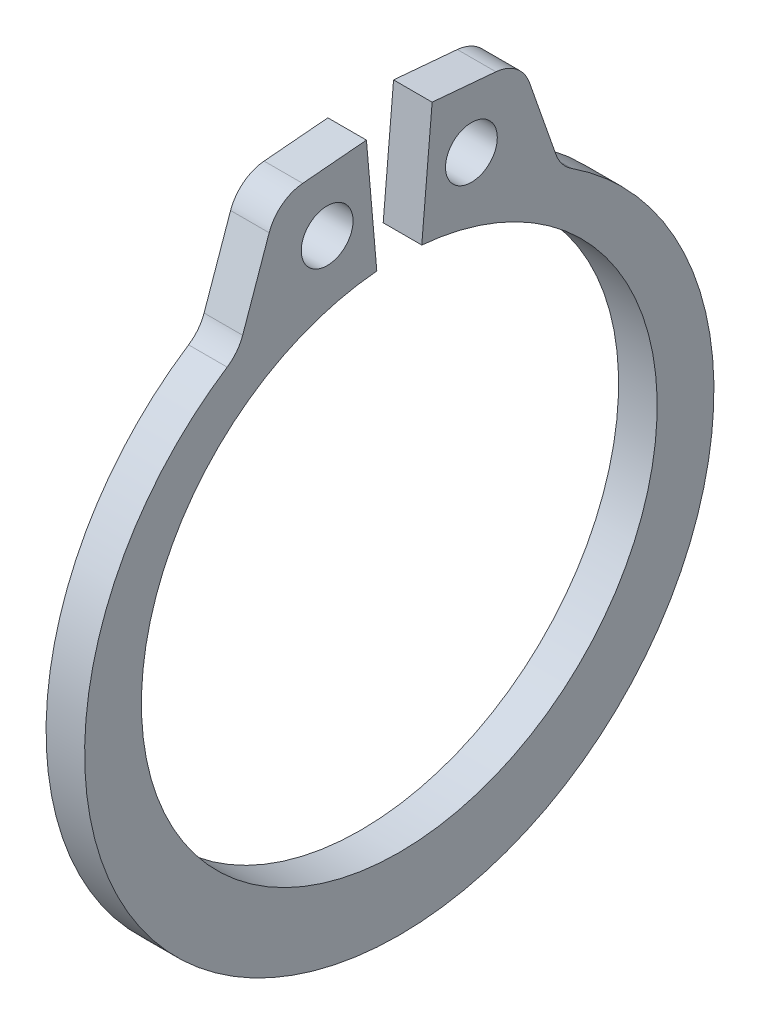
ISO-10303-21;
HEADER;
FILE_DESCRIPTION(('STEP AP214'),'2;1');
FILE_NAME('part.step','',(''),(''),'','','');
FILE_SCHEMA(('AUTOMOTIVE_DESIGN { 1 0 10303 214 1 1 1 1 }'));
ENDSEC;
DATA;
#1=APPLICATION_CONTEXT('core data for automotive mechanical design processes');
#2=APPLICATION_PROTOCOL_DEFINITION('international standard','automotive_design',2000,#1);
#3=PRODUCT_CONTEXT('',#1,'mechanical');
#4=PRODUCT('Part','Part','',(#3));
#5=PRODUCT_RELATED_PRODUCT_CATEGORY('part','',(#4));
#6=PRODUCT_DEFINITION_FORMATION('','',#4);
#7=PRODUCT_DEFINITION_CONTEXT('part definition',#1,'design');
#8=PRODUCT_DEFINITION('design','',#6,#7);
#9=PRODUCT_DEFINITION_SHAPE('','',#8);
#10=(LENGTH_UNIT() NAMED_UNIT(*) SI_UNIT(.MILLI.,.METRE.));
#11=(NAMED_UNIT(*) PLANE_ANGLE_UNIT() SI_UNIT($,.RADIAN.));
#12=(NAMED_UNIT(*) SI_UNIT($,.STERADIAN.) SOLID_ANGLE_UNIT());
#13=UNCERTAINTY_MEASURE_WITH_UNIT(LENGTH_MEASURE(1.E-05),#10,'distance_accuracy_value','');
#14=(GEOMETRIC_REPRESENTATION_CONTEXT(3) GLOBAL_UNCERTAINTY_ASSIGNED_CONTEXT((#13)) GLOBAL_UNIT_ASSIGNED_CONTEXT((#10,
#11,#12)) REPRESENTATION_CONTEXT('',''));
#15=CARTESIAN_POINT('',(0.,0.,0.));
#16=DIRECTION('',(0.,0.,1.));
#17=DIRECTION('',(1.,0.,0.));
#18=AXIS2_PLACEMENT_3D('',#15,#16,#17);
#19=CARTESIAN_POINT('',(0.4445,0.,0.));
#20=DIRECTION('',(1.,0.,0.));
#21=DIRECTION('',(0.,0.,-1.));
#22=AXIS2_PLACEMENT_3D('',#19,#20,#21);
#23=PLANE('',#22);
#24=CARTESIAN_POINT('',(0.4445,7.19770634291622,1.66234717527465));
#25=DIRECTION('',(1.,0.,0.));
#26=DIRECTION('',(0.,0.,-1.));
#27=AXIS2_PLACEMENT_3D('',#24,#25,#26);
#28=CIRCLE('',#27,0.5969);
#29=CARTESIAN_POINT('',(0.4445,7.19770634291622,1.06544717527465));
#30=VERTEX_POINT('',#29);
#31=EDGE_CURVE('E221',#30,#30,#28,.T.);
#32=ORIENTED_EDGE('',*,*,#31,.F.);
#33=EDGE_LOOP('',(#32));
#34=FACE_BOUND('',#33,.T.);
#35=DIRECTION('',(0.,-0.087155742747658,0.996194698091746));
#36=VECTOR('',#35,1.);
#37=CARTESIAN_POINT('',(0.4445,8.65374410338337,0.757104506100359));
#38=LINE('',#37,#36);
#39=CARTESIAN_POINT('',(0.4445,8.65374410338337,0.757104506100359));
#40=VERTEX_POINT('',#39);
#41=CARTESIAN_POINT('',(0.4445,8.52515651501671,2.22686736661734));
#42=VERTEX_POINT('',#41);
#43=EDGE_CURVE('E133',#40,#42,#38,.T.);
#44=ORIENTED_EDGE('',*,*,#43,.T.);
#45=CARTESIAN_POINT('',(0.4445,7.62688775574738,2.14827903338178));
#46=DIRECTION('',(1.,0.,0.));
#47=DIRECTION('',(0.,0.,-1.));
#48=AXIS2_PLACEMENT_3D('',#45,#46,#47);
#49=CIRCLE('',#48,0.9017);
#50=CARTESIAN_POINT('',(0.4445,7.9251756108609,2.99921219497074));
#51=VERTEX_POINT('',#50);
#52=EDGE_CURVE('E174',#42,#51,#49,.T.);
#53=ORIENTED_EDGE('',*,*,#52,.T.);
#54=DIRECTION('',(0.,-0.943698748573754,0.330806094170482));
#55=VECTOR('',#54,1.);
#56=CARTESIAN_POINT('',(0.4445,8.47442987825434,2.80667547795432));
#57=LINE('',#56,#55);
#58=CARTESIAN_POINT('',(0.4445,6.18417578583711,3.60950584316942));
#59=VERTEX_POINT('',#58);
#60=EDGE_CURVE('E213',#51,#59,#57,.T.);
#61=ORIENTED_EDGE('',*,*,#60,.T.);
#62=CARTESIAN_POINT('',(0.4445,6.48246364095064,4.46043900475838));
#63=DIRECTION('',(1.,0.,0.));
#64=DIRECTION('',(0.,0.,-1.));
#65=AXIS2_PLACEMENT_3D('',#62,#63,#64);
#66=CIRCLE('',#65,0.9017);
#67=CARTESIAN_POINT('',(0.4445,5.72765522704849,3.96715698775136));
#68=VERTEX_POINT('',#67);
#69=EDGE_CURVE('E181',#59,#68,#66,.F.);
#70=ORIENTED_EDGE('',*,*,#69,.T.);
#71=CARTESIAN_POINT('',(0.4445,-0.342794070483488,0.));
#72=DIRECTION('',(1.,0.,0.));
#73=DIRECTION('',(0.,0.,-1.));
#74=AXIS2_PLACEMENT_3D('',#71,#72,#73);
#75=CIRCLE('',#74,7.25180592951651);
#76=CARTESIAN_POINT('',(0.4445,5.72765522704849,-3.96715698775136));
#77=VERTEX_POINT('',#76);
#78=EDGE_CURVE('E206',#68,#77,#75,.T.);
#79=ORIENTED_EDGE('',*,*,#78,.T.);
#80=CARTESIAN_POINT('',(0.4445,6.48246364095064,-4.46043900475838));
#81=DIRECTION('',(1.,0.,0.));
#82=DIRECTION('',(0.,0.,-1.));
#83=AXIS2_PLACEMENT_3D('',#80,#81,#82);
#84=CIRCLE('',#83,0.9017);
#85=CARTESIAN_POINT('',(0.4445,6.18417578583711,-3.60950584316942));
#86=VERTEX_POINT('',#85);
#87=EDGE_CURVE('E11',#77,#86,#84,.F.);
#88=ORIENTED_EDGE('',*,*,#87,.T.);
#89=DIRECTION('',(0.,0.943698748573754,0.330806094170482));
#90=VECTOR('',#89,1.);
#91=CARTESIAN_POINT('',(0.4445,8.47442987825434,-2.80667547795432));
#92=LINE('',#91,#90);
#93=CARTESIAN_POINT('',(0.4445,7.9251756108609,-2.99921219497074));
#94=VERTEX_POINT('',#93);
#95=EDGE_CURVE('E205',#86,#94,#92,.T.);
#96=ORIENTED_EDGE('',*,*,#95,.T.);
#97=CARTESIAN_POINT('',(0.4445,7.62688775574738,-2.14827903338178));
#98=DIRECTION('',(1.,0.,0.));
#99=DIRECTION('',(0.,0.,-1.));
#100=AXIS2_PLACEMENT_3D('',#97,#98,#99);
#101=CIRCLE('',#100,0.9017);
#102=CARTESIAN_POINT('',(0.4445,8.52515651501671,-2.22686736661734));
#103=VERTEX_POINT('',#102);
#104=EDGE_CURVE('E49',#94,#103,#101,.T.);
#105=ORIENTED_EDGE('',*,*,#104,.T.);
#106=DIRECTION('',(0.,0.087155742747658,0.996194698091746));
#107=VECTOR('',#106,1.);
#108=CARTESIAN_POINT('',(0.4445,8.65374410338337,-0.757104506100359));
#109=LINE('',#108,#107);
#110=CARTESIAN_POINT('',(0.4445,8.65374410338337,-0.757104506100359));
#111=VERTEX_POINT('',#110);
#112=EDGE_CURVE('E210',#103,#111,#109,.T.);
#113=ORIENTED_EDGE('',*,*,#112,.T.);
#114=DIRECTION('',(0.,-0.996194698091745,0.0871557427476585));
#115=VECTOR('',#114,1.);
#116=CARTESIAN_POINT('',(0.4445,5.9209828075781,-0.518018872594983));
#117=LINE('',#116,#115);
#118=CARTESIAN_POINT('',(0.4445,5.9209828075781,-0.518018872594983));
#119=VERTEX_POINT('',#118);
#120=EDGE_CURVE('E139',#111,#119,#117,.T.);
#121=ORIENTED_EDGE('',*,*,#120,.T.);
#122=CARTESIAN_POINT('',(0.4445,0.,0.));
#123=DIRECTION('',(-1.,0.,0.));
#124=DIRECTION('',(0.,0.,-1.));
#125=AXIS2_PLACEMENT_3D('',#122,#123,#124);
#126=CIRCLE('',#125,5.9436);
#127=CARTESIAN_POINT('',(0.4445,5.9209828075781,0.518018872594983));
#128=VERTEX_POINT('',#127);
#129=EDGE_CURVE('E134',#119,#128,#126,.T.);
#130=ORIENTED_EDGE('',*,*,#129,.T.);
#131=DIRECTION('',(0.,0.996194698091745,0.0871557427476585));
#132=VECTOR('',#131,1.);
#133=CARTESIAN_POINT('',(0.4445,5.9209828075781,0.518018872594983));
#134=LINE('',#133,#132);
#135=EDGE_CURVE('E125',#128,#40,#134,.T.);
#136=ORIENTED_EDGE('',*,*,#135,.T.);
#137=EDGE_LOOP('',(#44,#53,#61,#70,#79,#88,#96,#105,#113,#121,#130,#136));
#138=FACE_BOUND('',#137,.T.);
#139=CARTESIAN_POINT('',(0.4445,7.19770634291622,-1.66234717527465));
#140=DIRECTION('',(1.,0.,0.));
#141=DIRECTION('',(0.,0.,-1.));
#142=AXIS2_PLACEMENT_3D('',#139,#140,#141);
#143=CIRCLE('',#142,0.5969);
#144=CARTESIAN_POINT('',(0.4445,7.19770634291622,-2.25924717527465));
#145=VERTEX_POINT('',#144);
#146=EDGE_CURVE('E247',#145,#145,#143,.T.);
#147=ORIENTED_EDGE('',*,*,#146,.F.);
#148=EDGE_LOOP('',(#147));
#149=FACE_BOUND('',#148,.T.);
#150=ADVANCED_FACE('F34',(#34,#138,#149),#23,.T.);
#151=CARTESIAN_POINT('',(-0.4445,0.,0.));
#152=DIRECTION('',(1.,0.,0.));
#153=DIRECTION('',(0.,0.,-1.));
#154=AXIS2_PLACEMENT_3D('',#151,#152,#153);
#155=PLANE('',#154);
#156=DIRECTION('',(0.,-0.943698748573754,0.330806094170482));
#157=VECTOR('',#156,1.);
#158=CARTESIAN_POINT('',(-0.4445,8.47442987825434,2.80667547795432));
#159=LINE('',#158,#157);
#160=CARTESIAN_POINT('',(-0.4445,7.9251756108609,2.99921219497074));
#161=VERTEX_POINT('',#160);
#162=CARTESIAN_POINT('',(-0.4445,6.18417578583711,3.60950584316942));
#163=VERTEX_POINT('',#162);
#164=EDGE_CURVE('E200',#161,#163,#159,.T.);
#165=ORIENTED_EDGE('',*,*,#164,.F.);
#166=CARTESIAN_POINT('',(-0.4445,7.62688775574738,2.14827903338178));
#167=DIRECTION('',(1.,0.,0.));
#168=DIRECTION('',(0.,0.,-1.));
#169=AXIS2_PLACEMENT_3D('',#166,#167,#168);
#170=CIRCLE('',#169,0.9017);
#171=CARTESIAN_POINT('',(-0.4445,8.52515651501671,2.22686736661734));
#172=VERTEX_POINT('',#171);
#173=EDGE_CURVE('E170',#161,#172,#170,.F.);
#174=ORIENTED_EDGE('',*,*,#173,.T.);
#175=DIRECTION('',(0.,-0.087155742747658,0.996194698091746));
#176=VECTOR('',#175,1.);
#177=CARTESIAN_POINT('',(-0.4445,8.65374410338337,0.757104506100359));
#178=LINE('',#177,#176);
#179=CARTESIAN_POINT('',(-0.4445,8.65374410338337,0.757104506100359));
#180=VERTEX_POINT('',#179);
#181=EDGE_CURVE('E223',#180,#172,#178,.T.);
#182=ORIENTED_EDGE('',*,*,#181,.F.);
#183=DIRECTION('',(0.,0.996194698091745,0.0871557427476585));
#184=VECTOR('',#183,1.);
#185=CARTESIAN_POINT('',(-0.4445,5.9209828075781,0.518018872594983));
#186=LINE('',#185,#184);
#187=CARTESIAN_POINT('',(-0.4445,5.9209828075781,0.518018872594983));
#188=VERTEX_POINT('',#187);
#189=EDGE_CURVE('E220',#188,#180,#186,.T.);
#190=ORIENTED_EDGE('',*,*,#189,.F.);
#191=CARTESIAN_POINT('',(-0.4445,0.,0.));
#192=DIRECTION('',(-1.,0.,0.));
#193=DIRECTION('',(0.,0.,-1.));
#194=AXIS2_PLACEMENT_3D('',#191,#192,#193);
#195=CIRCLE('',#194,5.9436);
#196=CARTESIAN_POINT('',(-0.4445,5.9209828075781,-0.518018872594983));
#197=VERTEX_POINT('',#196);
#198=EDGE_CURVE('E147',#197,#188,#195,.T.);
#199=ORIENTED_EDGE('',*,*,#198,.F.);
#200=DIRECTION('',(0.,-0.996194698091745,0.0871557427476585));
#201=VECTOR('',#200,1.);
#202=CARTESIAN_POINT('',(-0.4445,5.9209828075781,-0.518018872594983));
#203=LINE('',#202,#201);
#204=CARTESIAN_POINT('',(-0.4445,8.65374410338337,-0.757104506100359));
#205=VERTEX_POINT('',#204);
#206=EDGE_CURVE('E143',#205,#197,#203,.T.);
#207=ORIENTED_EDGE('',*,*,#206,.F.);
#208=DIRECTION('',(0.,0.087155742747658,0.996194698091746));
#209=VECTOR('',#208,1.);
#210=CARTESIAN_POINT('',(-0.4445,8.65374410338337,-0.757104506100359));
#211=LINE('',#210,#209);
#212=CARTESIAN_POINT('',(-0.4445,8.52515651501671,-2.22686736661734));
#213=VERTEX_POINT('',#212);
#214=EDGE_CURVE('E228',#213,#205,#211,.T.);
#215=ORIENTED_EDGE('',*,*,#214,.F.);
#216=CARTESIAN_POINT('',(-0.4445,7.62688775574738,-2.14827903338178));
#217=DIRECTION('',(1.,0.,0.));
#218=DIRECTION('',(0.,0.,-1.));
#219=AXIS2_PLACEMENT_3D('',#216,#217,#218);
#220=CIRCLE('',#219,0.9017);
#221=CARTESIAN_POINT('',(-0.4445,7.9251756108609,-2.99921219497074));
#222=VERTEX_POINT('',#221);
#223=EDGE_CURVE('E168',#213,#222,#220,.F.);
#224=ORIENTED_EDGE('',*,*,#223,.T.);
#225=DIRECTION('',(0.,0.943698748573754,0.330806094170482));
#226=VECTOR('',#225,1.);
#227=CARTESIAN_POINT('',(-0.4445,8.47442987825434,-2.80667547795432));
#228=LINE('',#227,#226);
#229=CARTESIAN_POINT('',(-0.4445,6.18417578583711,-3.60950584316942));
#230=VERTEX_POINT('',#229);
#231=EDGE_CURVE('E191',#230,#222,#228,.T.);
#232=ORIENTED_EDGE('',*,*,#231,.F.);
#233=CARTESIAN_POINT('',(-0.4445,6.48246364095064,-4.46043900475838));
#234=DIRECTION('',(1.,0.,0.));
#235=DIRECTION('',(0.,0.,-1.));
#236=AXIS2_PLACEMENT_3D('',#233,#234,#235);
#237=CIRCLE('',#236,0.9017);
#238=CARTESIAN_POINT('',(-0.4445,5.72765522704849,-3.96715698775136));
#239=VERTEX_POINT('',#238);
#240=EDGE_CURVE('E42',#230,#239,#237,.T.);
#241=ORIENTED_EDGE('',*,*,#240,.T.);
#242=CARTESIAN_POINT('',(-0.4445,-0.342794070483488,0.));
#243=DIRECTION('',(1.,0.,0.));
#244=DIRECTION('',(0.,0.,-1.));
#245=AXIS2_PLACEMENT_3D('',#242,#243,#244);
#246=CIRCLE('',#245,7.25180592951651);
#247=CARTESIAN_POINT('',(-0.4445,5.72765522704849,3.96715698775136));
#248=VERTEX_POINT('',#247);
#249=EDGE_CURVE('E189',#248,#239,#246,.T.);
#250=ORIENTED_EDGE('',*,*,#249,.F.);
#251=CARTESIAN_POINT('',(-0.4445,6.48246364095064,4.46043900475838));
#252=DIRECTION('',(1.,0.,0.));
#253=DIRECTION('',(0.,0.,-1.));
#254=AXIS2_PLACEMENT_3D('',#251,#252,#253);
#255=CIRCLE('',#254,0.9017);
#256=EDGE_CURVE('E179',#248,#163,#255,.T.);
#257=ORIENTED_EDGE('',*,*,#256,.T.);
#258=EDGE_LOOP('',(#165,#174,#182,#190,#199,#207,#215,#224,#232,#241,#250,#257));
#259=FACE_BOUND('',#258,.T.);
#260=CARTESIAN_POINT('',(-0.4445,7.19770634291622,1.66234717527465));
#261=DIRECTION('',(1.,0.,0.));
#262=DIRECTION('',(0.,0.,-1.));
#263=AXIS2_PLACEMENT_3D('',#260,#261,#262);
#264=CIRCLE('',#263,0.5969);
#265=CARTESIAN_POINT('',(-0.4445,7.19770634291622,1.06544717527465));
#266=VERTEX_POINT('',#265);
#267=EDGE_CURVE('E244',#266,#266,#264,.T.);
#268=ORIENTED_EDGE('',*,*,#267,.T.);
#269=EDGE_LOOP('',(#268));
#270=FACE_BOUND('',#269,.T.);
#271=CARTESIAN_POINT('',(-0.4445,7.19770634291622,-1.66234717527465));
#272=DIRECTION('',(1.,0.,0.));
#273=DIRECTION('',(0.,0.,-1.));
#274=AXIS2_PLACEMENT_3D('',#271,#272,#273);
#275=CIRCLE('',#274,0.5969);
#276=CARTESIAN_POINT('',(-0.4445,7.19770634291622,-2.25924717527465));
#277=VERTEX_POINT('',#276);
#278=EDGE_CURVE('E250',#277,#277,#275,.T.);
#279=ORIENTED_EDGE('',*,*,#278,.T.);
#280=EDGE_LOOP('',(#279));
#281=FACE_BOUND('',#280,.T.);
#282=ADVANCED_FACE('F187',(#259,#270,#281),#155,.F.);
#283=CARTESIAN_POINT('',(0.4445,0.,0.));
#284=DIRECTION('',(-1.,0.,0.));
#285=DIRECTION('',(0.,0.,1.));
#286=AXIS2_PLACEMENT_3D('',#283,#284,#285);
#287=CYLINDRICAL_SURFACE('',#286,5.9436);
#288=ORIENTED_EDGE('',*,*,#198,.T.);
#289=DIRECTION('',(-1.,0.,0.));
#290=VECTOR('',#289,1.);
#291=CARTESIAN_POINT('',(0.4445,5.9209828075781,0.518018872594983));
#292=LINE('',#291,#290);
#293=EDGE_CURVE('E129',#128,#188,#292,.T.);
#294=ORIENTED_EDGE('',*,*,#293,.F.);
#295=ORIENTED_EDGE('',*,*,#129,.F.);
#296=DIRECTION('',(-1.,0.,0.));
#297=VECTOR('',#296,1.);
#298=CARTESIAN_POINT('',(0.4445,5.9209828075781,-0.518018872594983));
#299=LINE('',#298,#297);
#300=EDGE_CURVE('E218',#119,#197,#299,.T.);
#301=ORIENTED_EDGE('',*,*,#300,.T.);
#302=EDGE_LOOP('',(#288,#294,#295,#301));
#303=FACE_BOUND('',#302,.T.);
#304=ADVANCED_FACE('F145',(#303),#287,.F.);
#305=CARTESIAN_POINT('',(0.4445,5.9209828075781,0.518018872594983));
#306=DIRECTION('',(0.,-0.0871557427476585,0.996194698091745));
#307=DIRECTION('',(0.,-0.996194698091746,-0.0871557427476585));
#308=AXIS2_PLACEMENT_3D('',#305,#306,#307);
#309=PLANE('',#308);
#310=ORIENTED_EDGE('',*,*,#189,.T.);
#311=DIRECTION('',(-1.,0.,0.));
#312=VECTOR('',#311,1.);
#313=CARTESIAN_POINT('',(0.4445,8.65374410338337,0.757104506100359));
#314=LINE('',#313,#312);
#315=EDGE_CURVE('E132',#40,#180,#314,.T.);
#316=ORIENTED_EDGE('',*,*,#315,.F.);
#317=ORIENTED_EDGE('',*,*,#135,.F.);
#318=ORIENTED_EDGE('',*,*,#293,.T.);
#319=EDGE_LOOP('',(#310,#316,#317,#318));
#320=FACE_BOUND('',#319,.T.);
#321=ADVANCED_FACE('F127',(#320),#309,.F.);
#322=CARTESIAN_POINT('',(0.4445,8.65374410338337,0.757104506100359));
#323=DIRECTION('',(0.,-0.996194698091746,-0.087155742747658));
#324=DIRECTION('',(0.,0.087155742747658,-0.996194698091746));
#325=AXIS2_PLACEMENT_3D('',#322,#323,#324);
#326=PLANE('',#325);
#327=ORIENTED_EDGE('',*,*,#181,.T.);
#328=DIRECTION('',(-1.,0.,0.));
#329=VECTOR('',#328,1.);
#330=CARTESIAN_POINT('',(0.4445,8.52515651501671,2.22686736661734));
#331=LINE('',#330,#329);
#332=EDGE_CURVE('E57',#172,#42,#331,.F.);
#333=ORIENTED_EDGE('',*,*,#332,.T.);
#334=ORIENTED_EDGE('',*,*,#43,.F.);
#335=ORIENTED_EDGE('',*,*,#315,.T.);
#336=EDGE_LOOP('',(#327,#333,#334,#335));
#337=FACE_BOUND('',#336,.T.);
#338=ADVANCED_FACE('F239',(#337),#326,.F.);
#339=CARTESIAN_POINT('',(0.4445,8.47442987825434,2.80667547795432));
#340=DIRECTION('',(0.,-0.330806094170482,-0.943698748573754));
#341=DIRECTION('',(0.,0.943698748573754,-0.330806094170482));
#342=AXIS2_PLACEMENT_3D('',#339,#340,#341);
#343=PLANE('',#342);
#344=ORIENTED_EDGE('',*,*,#164,.T.);
#345=DIRECTION('',(1.,0.,0.));
#346=VECTOR('',#345,1.);
#347=CARTESIAN_POINT('',(0.4445,6.18417578583711,3.60950584316942));
#348=LINE('',#347,#346);
#349=EDGE_CURVE('E161',#163,#59,#348,.T.);
#350=ORIENTED_EDGE('',*,*,#349,.T.);
#351=ORIENTED_EDGE('',*,*,#60,.F.);
#352=DIRECTION('',(-1.,0.,0.));
#353=VECTOR('',#352,1.);
#354=CARTESIAN_POINT('',(0.4445,7.9251756108609,2.99921219497074));
#355=LINE('',#354,#353);
#356=EDGE_CURVE('E158',#51,#161,#355,.T.);
#357=ORIENTED_EDGE('',*,*,#356,.T.);
#358=EDGE_LOOP('',(#344,#350,#351,#357));
#359=FACE_BOUND('',#358,.T.);
#360=ADVANCED_FACE('F279',(#359),#343,.F.);
#361=CARTESIAN_POINT('',(0.4445,-0.342794070483488,0.));
#362=DIRECTION('',(-1.,0.,0.));
#363=DIRECTION('',(0.,0.,1.));
#364=AXIS2_PLACEMENT_3D('',#361,#362,#363);
#365=CYLINDRICAL_SURFACE('',#364,7.25180592951651);
#366=ORIENTED_EDGE('',*,*,#78,.F.);
#367=DIRECTION('',(-1.,0.,0.));
#368=VECTOR('',#367,1.);
#369=CARTESIAN_POINT('',(0.4445,5.72765522704849,3.96715698775136));
#370=LINE('',#369,#368);
#371=EDGE_CURVE('E150',#68,#248,#370,.T.);
#372=ORIENTED_EDGE('',*,*,#371,.T.);
#373=ORIENTED_EDGE('',*,*,#249,.T.);
#374=DIRECTION('',(-1.,0.,0.));
#375=VECTOR('',#374,1.);
#376=CARTESIAN_POINT('',(0.4445,5.72765522704849,-3.96715698775136));
#377=LINE('',#376,#375);
#378=EDGE_CURVE('E148',#239,#77,#377,.F.);
#379=ORIENTED_EDGE('',*,*,#378,.T.);
#380=EDGE_LOOP('',(#366,#372,#373,#379));
#381=FACE_BOUND('',#380,.T.);
#382=ADVANCED_FACE('F197',(#381),#365,.T.);
#383=CARTESIAN_POINT('',(0.4445,8.47442987825434,-2.80667547795432));
#384=DIRECTION('',(0.,-0.330806094170482,0.943698748573754));
#385=DIRECTION('',(0.,-0.943698748573754,-0.330806094170482));
#386=AXIS2_PLACEMENT_3D('',#383,#384,#385);
#387=PLANE('',#386);
#388=ORIENTED_EDGE('',*,*,#95,.F.);
#389=DIRECTION('',(1.,0.,0.));
#390=VECTOR('',#389,1.);
#391=CARTESIAN_POINT('',(-0.4445,6.18417578583711,-3.60950584316942));
#392=LINE('',#391,#390);
#393=EDGE_CURVE('E165',#86,#230,#392,.F.);
#394=ORIENTED_EDGE('',*,*,#393,.T.);
#395=ORIENTED_EDGE('',*,*,#231,.T.);
#396=DIRECTION('',(-1.,0.,0.));
#397=VECTOR('',#396,1.);
#398=CARTESIAN_POINT('',(0.4445,7.9251756108609,-2.99921219497074));
#399=LINE('',#398,#397);
#400=EDGE_CURVE('E163',#222,#94,#399,.F.);
#401=ORIENTED_EDGE('',*,*,#400,.T.);
#402=EDGE_LOOP('',(#388,#394,#395,#401));
#403=FACE_BOUND('',#402,.T.);
#404=ADVANCED_FACE('F208',(#403),#387,.F.);
#405=CARTESIAN_POINT('',(0.4445,8.65374410338337,-0.757104506100359));
#406=DIRECTION('',(0.,-0.996194698091746,0.087155742747658));
#407=DIRECTION('',(0.,-0.087155742747658,-0.996194698091746));
#408=AXIS2_PLACEMENT_3D('',#405,#406,#407);
#409=PLANE('',#408);
#410=ORIENTED_EDGE('',*,*,#112,.F.);
#411=DIRECTION('',(-1.,0.,0.));
#412=VECTOR('',#411,1.);
#413=CARTESIAN_POINT('',(0.4445,8.52515651501671,-2.22686736661734));
#414=LINE('',#413,#412);
#415=EDGE_CURVE('E176',#103,#213,#414,.T.);
#416=ORIENTED_EDGE('',*,*,#415,.T.);
#417=ORIENTED_EDGE('',*,*,#214,.T.);
#418=DIRECTION('',(-1.,0.,0.));
#419=VECTOR('',#418,1.);
#420=CARTESIAN_POINT('',(0.4445,8.65374410338337,-0.757104506100359));
#421=LINE('',#420,#419);
#422=EDGE_CURVE('E152',#111,#205,#421,.T.);
#423=ORIENTED_EDGE('',*,*,#422,.F.);
#424=EDGE_LOOP('',(#410,#416,#417,#423));
#425=FACE_BOUND('',#424,.T.);
#426=ADVANCED_FACE('F272',(#425),#409,.F.);
#427=CARTESIAN_POINT('',(0.4445,5.9209828075781,-0.518018872594983));
#428=DIRECTION('',(0.,-0.0871557427476585,-0.996194698091745));
#429=DIRECTION('',(0.,0.996194698091746,-0.0871557427476585));
#430=AXIS2_PLACEMENT_3D('',#427,#428,#429);
#431=PLANE('',#430);
#432=ORIENTED_EDGE('',*,*,#206,.T.);
#433=ORIENTED_EDGE('',*,*,#300,.F.);
#434=ORIENTED_EDGE('',*,*,#120,.F.);
#435=ORIENTED_EDGE('',*,*,#422,.T.);
#436=EDGE_LOOP('',(#432,#433,#434,#435));
#437=FACE_BOUND('',#436,.T.);
#438=ADVANCED_FACE('F235',(#437),#431,.F.);
#439=CARTESIAN_POINT('',(0.4445,7.19770634291622,1.66234717527465));
#440=DIRECTION('',(-1.,0.,0.));
#441=DIRECTION('',(0.,0.,1.));
#442=AXIS2_PLACEMENT_3D('',#439,#440,#441);
#443=CYLINDRICAL_SURFACE('',#442,0.5969);
#444=ORIENTED_EDGE('',*,*,#31,.T.);
#445=EDGE_LOOP('',(#444));
#446=FACE_BOUND('',#445,.T.);
#447=ORIENTED_EDGE('',*,*,#267,.F.);
#448=EDGE_LOOP('',(#447));
#449=FACE_BOUND('',#448,.T.);
#450=ADVANCED_FACE('F267',(#446,#449),#443,.F.);
#451=CARTESIAN_POINT('',(0.4445,7.19770634291622,-1.66234717527465));
#452=DIRECTION('',(-1.,0.,0.));
#453=DIRECTION('',(0.,0.,1.));
#454=AXIS2_PLACEMENT_3D('',#451,#452,#453);
#455=CYLINDRICAL_SURFACE('',#454,0.5969);
#456=ORIENTED_EDGE('',*,*,#146,.T.);
#457=EDGE_LOOP('',(#456));
#458=FACE_BOUND('',#457,.T.);
#459=ORIENTED_EDGE('',*,*,#278,.F.);
#460=EDGE_LOOP('',(#459));
#461=FACE_BOUND('',#460,.T.);
#462=ADVANCED_FACE('F256',(#458,#461),#455,.F.);
#463=CARTESIAN_POINT('',(0.4445,6.48246364095064,4.46043900475838));
#464=DIRECTION('',(-1.,0.,0.));
#465=DIRECTION('',(0.,0.,1.));
#466=AXIS2_PLACEMENT_3D('',#463,#464,#465);
#467=CYLINDRICAL_SURFACE('',#466,0.9017);
#468=ORIENTED_EDGE('',*,*,#69,.F.);
#469=ORIENTED_EDGE('',*,*,#349,.F.);
#470=ORIENTED_EDGE('',*,*,#256,.F.);
#471=ORIENTED_EDGE('',*,*,#371,.F.);
#472=EDGE_LOOP('',(#468,#469,#470,#471));
#473=FACE_BOUND('',#472,.T.);
#474=ADVANCED_FACE('F289',(#473),#467,.F.);
#475=CARTESIAN_POINT('',(0.4445,6.48246364095064,-4.46043900475838));
#476=DIRECTION('',(-1.,0.,0.));
#477=DIRECTION('',(0.,0.,1.));
#478=AXIS2_PLACEMENT_3D('',#475,#476,#477);
#479=CYLINDRICAL_SURFACE('',#478,0.9017);
#480=ORIENTED_EDGE('',*,*,#87,.F.);
#481=ORIENTED_EDGE('',*,*,#378,.F.);
#482=ORIENTED_EDGE('',*,*,#240,.F.);
#483=ORIENTED_EDGE('',*,*,#393,.F.);
#484=EDGE_LOOP('',(#480,#481,#482,#483));
#485=FACE_BOUND('',#484,.T.);
#486=ADVANCED_FACE('F203',(#485),#479,.F.);
#487=CARTESIAN_POINT('',(0.4445,7.62688775574738,2.14827903338178));
#488=DIRECTION('',(-1.,0.,0.));
#489=DIRECTION('',(0.,0.,1.));
#490=AXIS2_PLACEMENT_3D('',#487,#488,#489);
#491=CYLINDRICAL_SURFACE('',#490,0.9017);
#492=ORIENTED_EDGE('',*,*,#52,.F.);
#493=ORIENTED_EDGE('',*,*,#332,.F.);
#494=ORIENTED_EDGE('',*,*,#173,.F.);
#495=ORIENTED_EDGE('',*,*,#356,.F.);
#496=EDGE_LOOP('',(#492,#493,#494,#495));
#497=FACE_BOUND('',#496,.T.);
#498=ADVANCED_FACE('F294',(#497),#491,.T.);
#499=CARTESIAN_POINT('',(0.4445,7.62688775574738,-2.14827903338178));
#500=DIRECTION('',(-1.,0.,0.));
#501=DIRECTION('',(0.,0.,1.));
#502=AXIS2_PLACEMENT_3D('',#499,#500,#501);
#503=CYLINDRICAL_SURFACE('',#502,0.9017);
#504=ORIENTED_EDGE('',*,*,#104,.F.);
#505=ORIENTED_EDGE('',*,*,#400,.F.);
#506=ORIENTED_EDGE('',*,*,#223,.F.);
#507=ORIENTED_EDGE('',*,*,#415,.F.);
#508=EDGE_LOOP('',(#504,#505,#506,#507));
#509=FACE_BOUND('',#508,.T.);
#510=ADVANCED_FACE('F36',(#509),#503,.T.);
#511=CLOSED_SHELL('',(#150,#282,#304,#321,#338,#360,#382,#404,#426,#438,#450,#462,#474,#486,
#498,#510));
#512=MANIFOLD_SOLID_BREP('B2',#511);
#513=ADVANCED_BREP_SHAPE_REPRESENTATION('',(#18,#512),#14);
#514=SHAPE_DEFINITION_REPRESENTATION(#9,#513);
ENDSEC;
END-ISO-10303-21;
